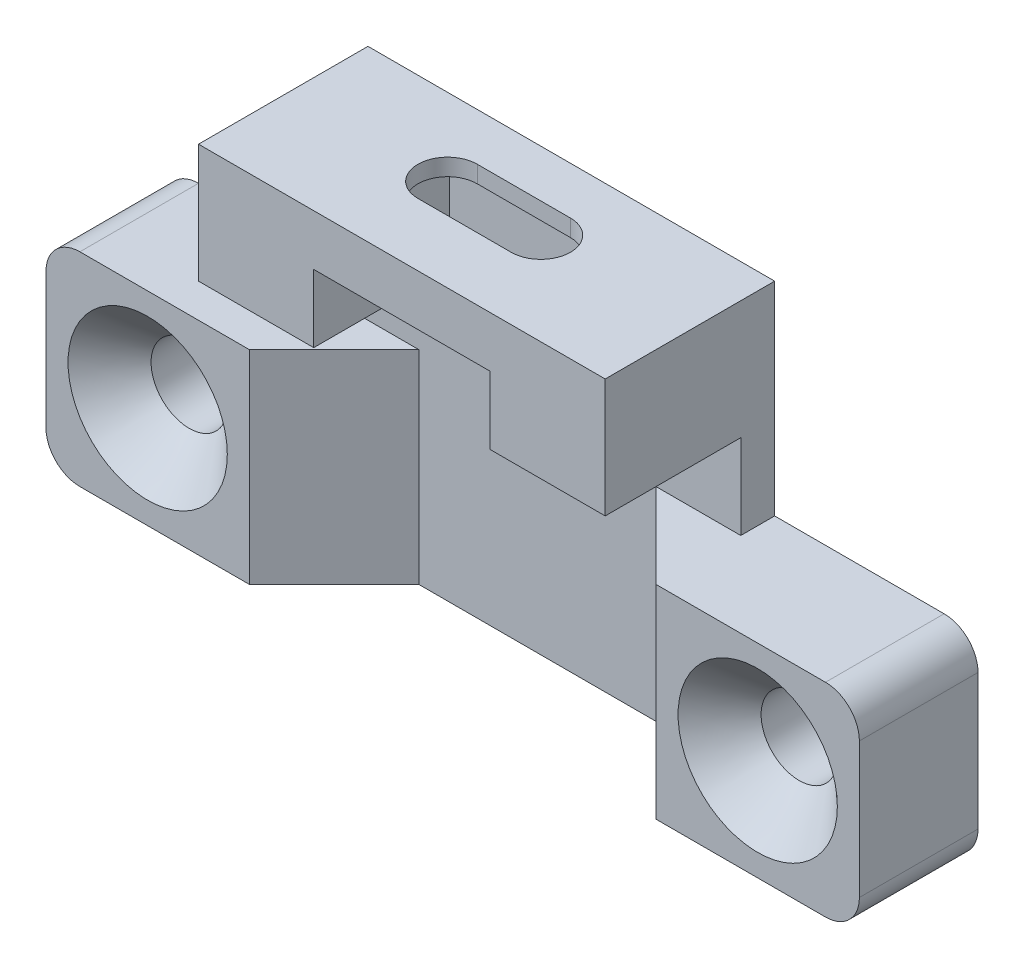
ISO-10303-21;
HEADER;
FILE_DESCRIPTION(('STEP AP214'),'2;1');
FILE_NAME('part.step','',(''),(''),'','','');
FILE_SCHEMA(('AUTOMOTIVE_DESIGN { 1 0 10303 214 1 1 1 1 }'));
ENDSEC;
DATA;
#1=APPLICATION_CONTEXT('core data for automotive mechanical design processes');
#2=APPLICATION_PROTOCOL_DEFINITION('international standard','automotive_design',2000,#1);
#3=PRODUCT_CONTEXT('',#1,'mechanical');
#4=PRODUCT('Part','Part','',(#3));
#5=PRODUCT_RELATED_PRODUCT_CATEGORY('part','',(#4));
#6=PRODUCT_DEFINITION_FORMATION('','',#4);
#7=PRODUCT_DEFINITION_CONTEXT('part definition',#1,'design');
#8=PRODUCT_DEFINITION('design','',#6,#7);
#9=PRODUCT_DEFINITION_SHAPE('','',#8);
#10=(LENGTH_UNIT() NAMED_UNIT(*) SI_UNIT(.MILLI.,.METRE.));
#11=(NAMED_UNIT(*) PLANE_ANGLE_UNIT() SI_UNIT($,.RADIAN.));
#12=(NAMED_UNIT(*) SI_UNIT($,.STERADIAN.) SOLID_ANGLE_UNIT());
#13=UNCERTAINTY_MEASURE_WITH_UNIT(LENGTH_MEASURE(1.E-05),#10,'distance_accuracy_value','');
#14=(GEOMETRIC_REPRESENTATION_CONTEXT(3) GLOBAL_UNCERTAINTY_ASSIGNED_CONTEXT((#13)) GLOBAL_UNIT_ASSIGNED_CONTEXT((#10,
#11,#12)) REPRESENTATION_CONTEXT('',''));
#15=CARTESIAN_POINT('',(0.,0.,0.));
#16=DIRECTION('',(0.,0.,1.));
#17=DIRECTION('',(1.,0.,0.));
#18=AXIS2_PLACEMENT_3D('',#15,#16,#17);
#19=CARTESIAN_POINT('',(5.2,-0.999999999999997,2.));
#20=DIRECTION('',(0.,1.,0.));
#21=DIRECTION('',(0.,0.,1.));
#22=AXIS2_PLACEMENT_3D('',#19,#20,#21);
#23=PLANE('',#22);
#24=DIRECTION('',(1.,0.,0.));
#25=VECTOR('',#24,1.);
#26=CARTESIAN_POINT('',(5.2,-0.999999999999997,2.8));
#27=LINE('',#26,#25);
#28=CARTESIAN_POINT('',(-2.75,-0.999999999999997,2.8));
#29=VERTEX_POINT('',#28);
#30=CARTESIAN_POINT('',(2.75,-0.999999999999997,2.8));
#31=VERTEX_POINT('',#30);
#32=EDGE_CURVE('E505',#29,#31,#27,.T.);
#33=ORIENTED_EDGE('',*,*,#32,.F.);
#34=CARTESIAN_POINT('',(-2.75,-0.999999999999997,4.55));
#35=DIRECTION('',(0.,1.,0.));
#36=DIRECTION('',(0.,0.,1.));
#37=AXIS2_PLACEMENT_3D('',#34,#35,#36);
#38=CIRCLE('',#37,1.75);
#39=CARTESIAN_POINT('',(-2.75,-0.999999999999997,6.3));
#40=VERTEX_POINT('',#39);
#41=EDGE_CURVE('E508',#29,#40,#38,.T.);
#42=ORIENTED_EDGE('',*,*,#41,.T.);
#43=DIRECTION('',(1.,0.,0.));
#44=VECTOR('',#43,1.);
#45=CARTESIAN_POINT('',(5.2,-0.999999999999997,6.3));
#46=LINE('',#45,#44);
#47=CARTESIAN_POINT('',(2.75,-0.999999999999997,6.3));
#48=VERTEX_POINT('',#47);
#49=EDGE_CURVE('E497',#40,#48,#46,.T.);
#50=ORIENTED_EDGE('',*,*,#49,.T.);
#51=CARTESIAN_POINT('',(2.75,-0.999999999999997,4.55));
#52=DIRECTION('',(0.,1.,0.));
#53=DIRECTION('',(0.,0.,1.));
#54=AXIS2_PLACEMENT_3D('',#51,#52,#53);
#55=CIRCLE('',#54,1.75);
#56=EDGE_CURVE('E501',#48,#31,#55,.T.);
#57=ORIENTED_EDGE('',*,*,#56,.T.);
#58=EDGE_LOOP('',(#33,#42,#50,#57));
#59=FACE_BOUND('',#58,.T.);
#60=DIRECTION('',(0.,0.,1.));
#61=VECTOR('',#60,1.);
#62=CARTESIAN_POINT('',(5.2,-0.999999999999997,2.));
#63=LINE('',#62,#61);
#64=CARTESIAN_POINT('',(5.2,-0.999999999999997,2.));
#65=VERTEX_POINT('',#64);
#66=CARTESIAN_POINT('',(5.2,-0.999999999999997,6.99999999999999));
#67=VERTEX_POINT('',#66);
#68=EDGE_CURVE('E416',#65,#67,#63,.T.);
#69=ORIENTED_EDGE('',*,*,#68,.T.);
#70=DIRECTION('',(-1.,0.,0.));
#71=VECTOR('',#70,1.);
#72=CARTESIAN_POINT('',(-5.2,-0.999999999999997,6.99999999999999));
#73=LINE('',#72,#71);
#74=CARTESIAN_POINT('',(-5.2,-0.999999999999997,6.99999999999999));
#75=VERTEX_POINT('',#74);
#76=EDGE_CURVE('E583',#67,#75,#73,.T.);
#77=ORIENTED_EDGE('',*,*,#76,.T.);
#78=DIRECTION('',(0.,0.,1.));
#79=VECTOR('',#78,1.);
#80=CARTESIAN_POINT('',(-5.2,-0.999999999999997,2.));
#81=LINE('',#80,#79);
#82=CARTESIAN_POINT('',(-5.2,-0.999999999999997,2.));
#83=VERTEX_POINT('',#82);
#84=EDGE_CURVE('E410',#83,#75,#81,.T.);
#85=ORIENTED_EDGE('',*,*,#84,.F.);
#86=DIRECTION('',(-1.,0.,0.));
#87=VECTOR('',#86,1.);
#88=CARTESIAN_POINT('',(5.2,-0.999999999999997,2.));
#89=LINE('',#88,#87);
#90=EDGE_CURVE('E387',#65,#83,#89,.T.);
#91=ORIENTED_EDGE('',*,*,#90,.F.);
#92=EDGE_LOOP('',(#69,#77,#85,#91));
#93=FACE_BOUND('',#92,.T.);
#94=ADVANCED_FACE('F47',(#59,#93),#23,.F.);
#95=CARTESIAN_POINT('',(0.,0.,2.));
#96=DIRECTION('',(0.,0.,1.));
#97=DIRECTION('',(1.,0.,0.));
#98=AXIS2_PLACEMENT_3D('',#95,#96,#97);
#99=PLANE('',#98);
#100=DIRECTION('',(1.,0.,0.));
#101=VECTOR('',#100,1.);
#102=CARTESIAN_POINT('',(-24.,-24.,2.));
#103=LINE('',#102,#101);
#104=CARTESIAN_POINT('',(-7.00000000000002,-24.,2.));
#105=VERTEX_POINT('',#104);
#106=CARTESIAN_POINT('',(7.00000000000003,-24.,2.));
#107=VERTEX_POINT('',#106);
#108=EDGE_CURVE('E400',#105,#107,#103,.T.);
#109=ORIENTED_EDGE('',*,*,#108,.T.);
#110=DIRECTION('',(0.,1.,0.));
#111=VECTOR('',#110,1.);
#112=CARTESIAN_POINT('',(7.00000000000003,0.,2.));
#113=LINE('',#112,#111);
#114=CARTESIAN_POINT('',(7.00000000000003,-12.,2.));
#115=VERTEX_POINT('',#114);
#116=EDGE_CURVE('E521',#107,#115,#113,.T.);
#117=ORIENTED_EDGE('',*,*,#116,.T.);
#118=DIRECTION('',(1.,0.,0.));
#119=VECTOR('',#118,1.);
#120=CARTESIAN_POINT('',(0.,-12.,2.));
#121=LINE('',#120,#119);
#122=CARTESIAN_POINT('',(12.,-12.,2.));
#123=VERTEX_POINT('',#122);
#124=EDGE_CURVE('E518',#115,#123,#121,.T.);
#125=ORIENTED_EDGE('',*,*,#124,.T.);
#126=DIRECTION('',(0.,1.,0.));
#127=VECTOR('',#126,1.);
#128=CARTESIAN_POINT('',(12.,0.,2.));
#129=LINE('',#128,#127);
#130=CARTESIAN_POINT('',(12.,-7.,2.));
#131=VERTEX_POINT('',#130);
#132=EDGE_CURVE('E494',#123,#131,#129,.T.);
#133=ORIENTED_EDGE('',*,*,#132,.T.);
#134=DIRECTION('',(-1.,0.,0.));
#135=VECTOR('',#134,1.);
#136=CARTESIAN_POINT('',(24.,-7.,2.));
#137=LINE('',#136,#135);
#138=CARTESIAN_POINT('',(5.2,-7.,2.));
#139=VERTEX_POINT('',#138);
#140=EDGE_CURVE('E404',#131,#139,#137,.T.);
#141=ORIENTED_EDGE('',*,*,#140,.T.);
#142=DIRECTION('',(0.,1.,0.));
#143=VECTOR('',#142,1.);
#144=CARTESIAN_POINT('',(5.2,-7.,2.));
#145=LINE('',#144,#143);
#146=EDGE_CURVE('E407',#139,#65,#145,.T.);
#147=ORIENTED_EDGE('',*,*,#146,.T.);
#148=ORIENTED_EDGE('',*,*,#90,.T.);
#149=DIRECTION('',(0.,-1.,0.));
#150=VECTOR('',#149,1.);
#151=CARTESIAN_POINT('',(-5.2,-0.999999999999997,2.));
#152=LINE('',#151,#150);
#153=CARTESIAN_POINT('',(-5.2,-7.,2.));
#154=VERTEX_POINT('',#153);
#155=EDGE_CURVE('E391',#83,#154,#152,.T.);
#156=ORIENTED_EDGE('',*,*,#155,.T.);
#157=DIRECTION('',(-1.,0.,0.));
#158=VECTOR('',#157,1.);
#159=CARTESIAN_POINT('',(-5.2,-7.,2.));
#160=LINE('',#159,#158);
#161=CARTESIAN_POINT('',(-12.,-7.,2.));
#162=VERTEX_POINT('',#161);
#163=EDGE_CURVE('E396',#154,#162,#160,.T.);
#164=ORIENTED_EDGE('',*,*,#163,.T.);
#165=DIRECTION('',(0.,-1.,0.));
#166=VECTOR('',#165,1.);
#167=CARTESIAN_POINT('',(-12.,-12.,2.));
#168=LINE('',#167,#166);
#169=CARTESIAN_POINT('',(-12.,-12.,2.));
#170=VERTEX_POINT('',#169);
#171=EDGE_CURVE('E436',#162,#170,#168,.T.);
#172=ORIENTED_EDGE('',*,*,#171,.T.);
#173=DIRECTION('',(1.,0.,0.));
#174=VECTOR('',#173,1.);
#175=CARTESIAN_POINT('',(0.,-12.,2.));
#176=LINE('',#175,#174);
#177=CARTESIAN_POINT('',(-7.00000000000002,-12.,2.));
#178=VERTEX_POINT('',#177);
#179=EDGE_CURVE('E515',#170,#178,#176,.T.);
#180=ORIENTED_EDGE('',*,*,#179,.T.);
#181=DIRECTION('',(0.,-1.,0.));
#182=VECTOR('',#181,1.);
#183=CARTESIAN_POINT('',(-7.00000000000002,0.,2.));
#184=LINE('',#183,#182);
#185=EDGE_CURVE('E512',#178,#105,#184,.T.);
#186=ORIENTED_EDGE('',*,*,#185,.T.);
#187=EDGE_LOOP('',(#109,#117,#125,#133,#141,#147,#148,#156,#164,#172,#180,#186));
#188=FACE_BOUND('',#187,.T.);
#189=ADVANCED_FACE('F591',(#188),#99,.T.);
#190=CARTESIAN_POINT('',(-24.,-12.,10.));
#191=DIRECTION('',(0.,-1.,0.));
#192=DIRECTION('',(0.,0.,-1.));
#193=AXIS2_PLACEMENT_3D('',#190,#191,#192);
#194=PLANE('',#193);
#195=DIRECTION('',(-1.,0.,0.));
#196=VECTOR('',#195,1.);
#197=CARTESIAN_POINT('',(-24.,-12.,0.));
#198=LINE('',#197,#196);
#199=CARTESIAN_POINT('',(-12.,-12.,0.));
#200=VERTEX_POINT('',#199);
#201=CARTESIAN_POINT('',(-22.,-12.,0.));
#202=VERTEX_POINT('',#201);
#203=EDGE_CURVE('E455',#200,#202,#198,.T.);
#204=ORIENTED_EDGE('',*,*,#203,.T.);
#205=DIRECTION('',(0.,0.,-1.));
#206=VECTOR('',#205,1.);
#207=CARTESIAN_POINT('',(-22.,-12.,10.));
#208=LINE('',#207,#206);
#209=CARTESIAN_POINT('',(-22.,-12.,7.));
#210=VERTEX_POINT('',#209);
#211=EDGE_CURVE('E568',#202,#210,#208,.F.);
#212=ORIENTED_EDGE('',*,*,#211,.T.);
#213=DIRECTION('',(-1.,0.,0.));
#214=VECTOR('',#213,1.);
#215=CARTESIAN_POINT('',(-24.,-12.,7.));
#216=LINE('',#215,#214);
#217=CARTESIAN_POINT('',(-12.,-12.,7.));
#218=VERTEX_POINT('',#217);
#219=EDGE_CURVE('E345',#218,#210,#216,.T.);
#220=ORIENTED_EDGE('',*,*,#219,.F.);
#221=DIRECTION('',(0.707106781186544,0.,-0.707106781186551));
#222=VECTOR('',#221,1.);
#223=CARTESIAN_POINT('',(-19.4999999999999,-12.,14.5));
#224=LINE('',#223,#222);
#225=EDGE_CURVE('E532',#218,#178,#224,.T.);
#226=ORIENTED_EDGE('',*,*,#225,.T.);
#227=ORIENTED_EDGE('',*,*,#179,.F.);
#228=DIRECTION('',(0.,0.,-1.));
#229=VECTOR('',#228,1.);
#230=CARTESIAN_POINT('',(-12.,-12.,10.));
#231=LINE('',#230,#229);
#232=EDGE_CURVE('E487',#170,#200,#231,.T.);
#233=ORIENTED_EDGE('',*,*,#232,.T.);
#234=EDGE_LOOP('',(#204,#212,#220,#226,#227,#233));
#235=FACE_BOUND('',#234,.T.);
#236=ADVANCED_FACE('F619',(#235),#194,.F.);
#237=CARTESIAN_POINT('',(-24.,-24.,10.));
#238=DIRECTION('',(1.,0.,0.));
#239=DIRECTION('',(0.,1.,0.));
#240=AXIS2_PLACEMENT_3D('',#237,#238,#239);
#241=PLANE('',#240);
#242=DIRECTION('',(0.,-1.,0.));
#243=VECTOR('',#242,1.);
#244=CARTESIAN_POINT('',(-24.,-24.,0.));
#245=LINE('',#244,#243);
#246=CARTESIAN_POINT('',(-24.,-14.,0.));
#247=VERTEX_POINT('',#246);
#248=CARTESIAN_POINT('',(-24.,-22.,0.));
#249=VERTEX_POINT('',#248);
#250=EDGE_CURVE('E459',#247,#249,#245,.T.);
#251=ORIENTED_EDGE('',*,*,#250,.T.);
#252=DIRECTION('',(0.,0.,-1.));
#253=VECTOR('',#252,1.);
#254=CARTESIAN_POINT('',(-24.,-22.,10.));
#255=LINE('',#254,#253);
#256=CARTESIAN_POINT('',(-24.,-22.,7.));
#257=VERTEX_POINT('',#256);
#258=EDGE_CURVE('E559',#249,#257,#255,.F.);
#259=ORIENTED_EDGE('',*,*,#258,.T.);
#260=DIRECTION('',(0.,-1.,0.));
#261=VECTOR('',#260,1.);
#262=CARTESIAN_POINT('',(-24.,-12.,7.));
#263=LINE('',#262,#261);
#264=CARTESIAN_POINT('',(-24.,-14.,7.));
#265=VERTEX_POINT('',#264);
#266=EDGE_CURVE('E333',#265,#257,#263,.T.);
#267=ORIENTED_EDGE('',*,*,#266,.F.);
#268=DIRECTION('',(0.,0.,-1.));
#269=VECTOR('',#268,1.);
#270=CARTESIAN_POINT('',(-24.,-14.,10.));
#271=LINE('',#270,#269);
#272=EDGE_CURVE('E555',#265,#247,#271,.T.);
#273=ORIENTED_EDGE('',*,*,#272,.T.);
#274=EDGE_LOOP('',(#251,#259,#267,#273));
#275=FACE_BOUND('',#274,.T.);
#276=ADVANCED_FACE('F631',(#275),#241,.F.);
#277=CARTESIAN_POINT('',(24.,-24.,10.));
#278=DIRECTION('',(0.,1.,0.));
#279=DIRECTION('',(-1.,0.,0.));
#280=AXIS2_PLACEMENT_3D('',#277,#278,#279);
#281=PLANE('',#280);
#282=DIRECTION('',(1.,0.,0.));
#283=VECTOR('',#282,1.);
#284=CARTESIAN_POINT('',(-24.,-24.,7.));
#285=LINE('',#284,#283);
#286=CARTESIAN_POINT('',(-22.,-24.,7.));
#287=VERTEX_POINT('',#286);
#288=CARTESIAN_POINT('',(-12.,-24.,7.));
#289=VERTEX_POINT('',#288);
#290=EDGE_CURVE('E337',#287,#289,#285,.T.);
#291=ORIENTED_EDGE('',*,*,#290,.F.);
#292=DIRECTION('',(0.,0.,-1.));
#293=VECTOR('',#292,1.);
#294=CARTESIAN_POINT('',(-22.,-24.,10.));
#295=LINE('',#294,#293);
#296=CARTESIAN_POINT('',(-22.,-24.,0.));
#297=VERTEX_POINT('',#296);
#298=EDGE_CURVE('E541',#287,#297,#295,.T.);
#299=ORIENTED_EDGE('',*,*,#298,.T.);
#300=DIRECTION('',(1.,0.,0.));
#301=VECTOR('',#300,1.);
#302=CARTESIAN_POINT('',(24.,-24.,0.));
#303=LINE('',#302,#301);
#304=CARTESIAN_POINT('',(22.,-24.,0.));
#305=VERTEX_POINT('',#304);
#306=EDGE_CURVE('E463',#297,#305,#303,.T.);
#307=ORIENTED_EDGE('',*,*,#306,.T.);
#308=DIRECTION('',(0.,0.,-1.));
#309=VECTOR('',#308,1.);
#310=CARTESIAN_POINT('',(22.,-24.,10.));
#311=LINE('',#310,#309);
#312=CARTESIAN_POINT('',(22.,-24.,7.));
#313=VERTEX_POINT('',#312);
#314=EDGE_CURVE('E539',#305,#313,#311,.F.);
#315=ORIENTED_EDGE('',*,*,#314,.T.);
#316=DIRECTION('',(1.,0.,0.));
#317=VECTOR('',#316,1.);
#318=CARTESIAN_POINT('',(24.,-24.,7.));
#319=LINE('',#318,#317);
#320=CARTESIAN_POINT('',(12.,-24.,7.));
#321=VERTEX_POINT('',#320);
#322=EDGE_CURVE('E332',#321,#313,#319,.T.);
#323=ORIENTED_EDGE('',*,*,#322,.F.);
#324=DIRECTION('',(-0.707106781186544,0.,-0.707106781186551));
#325=VECTOR('',#324,1.);
#326=CARTESIAN_POINT('',(19.4999999999999,-24.,14.5));
#327=LINE('',#326,#325);
#328=EDGE_CURVE('E525',#321,#107,#327,.T.);
#329=ORIENTED_EDGE('',*,*,#328,.T.);
#330=ORIENTED_EDGE('',*,*,#108,.F.);
#331=DIRECTION('',(-0.707106781186544,0.,0.707106781186551));
#332=VECTOR('',#331,1.);
#333=CARTESIAN_POINT('',(4.49999999999982,-24.,-9.49999999999997));
#334=LINE('',#333,#332);
#335=EDGE_CURVE('E535',#105,#289,#334,.T.);
#336=ORIENTED_EDGE('',*,*,#335,.T.);
#337=EDGE_LOOP('',(#291,#299,#307,#315,#323,#329,#330,#336));
#338=FACE_BOUND('',#337,.T.);
#339=ADVANCED_FACE('F641',(#338),#281,.F.);
#340=CARTESIAN_POINT('',(24.,-12.,10.));
#341=DIRECTION('',(-1.,0.,0.));
#342=DIRECTION('',(0.,-1.,0.));
#343=AXIS2_PLACEMENT_3D('',#340,#341,#342);
#344=PLANE('',#343);
#345=DIRECTION('',(0.,1.,0.));
#346=VECTOR('',#345,1.);
#347=CARTESIAN_POINT('',(24.,-12.,0.));
#348=LINE('',#347,#346);
#349=CARTESIAN_POINT('',(24.,-22.,0.));
#350=VERTEX_POINT('',#349);
#351=CARTESIAN_POINT('',(24.,-14.,0.));
#352=VERTEX_POINT('',#351);
#353=EDGE_CURVE('E467',#350,#352,#348,.T.);
#354=ORIENTED_EDGE('',*,*,#353,.T.);
#355=DIRECTION('',(0.,0.,-1.));
#356=VECTOR('',#355,1.);
#357=CARTESIAN_POINT('',(24.,-14.,10.));
#358=LINE('',#357,#356);
#359=CARTESIAN_POINT('',(24.,-14.,7.));
#360=VERTEX_POINT('',#359);
#361=EDGE_CURVE('E577',#352,#360,#358,.F.);
#362=ORIENTED_EDGE('',*,*,#361,.T.);
#363=DIRECTION('',(0.,1.,0.));
#364=VECTOR('',#363,1.);
#365=CARTESIAN_POINT('',(24.,-12.,7.));
#366=LINE('',#365,#364);
#367=CARTESIAN_POINT('',(24.,-22.,7.));
#368=VERTEX_POINT('',#367);
#369=EDGE_CURVE('E338',#368,#360,#366,.T.);
#370=ORIENTED_EDGE('',*,*,#369,.F.);
#371=DIRECTION('',(0.,0.,-1.));
#372=VECTOR('',#371,1.);
#373=CARTESIAN_POINT('',(24.,-22.,10.));
#374=LINE('',#373,#372);
#375=EDGE_CURVE('E574',#368,#350,#374,.T.);
#376=ORIENTED_EDGE('',*,*,#375,.T.);
#377=EDGE_LOOP('',(#354,#362,#370,#376));
#378=FACE_BOUND('',#377,.T.);
#379=ADVANCED_FACE('F650',(#378),#344,.F.);
#380=CARTESIAN_POINT('',(12.,-12.,10.));
#381=DIRECTION('',(0.,-1.,0.));
#382=DIRECTION('',(1.,0.,0.));
#383=AXIS2_PLACEMENT_3D('',#380,#381,#382);
#384=PLANE('',#383);
#385=DIRECTION('',(-1.,0.,0.));
#386=VECTOR('',#385,1.);
#387=CARTESIAN_POINT('',(24.,-12.,7.));
#388=LINE('',#387,#386);
#389=CARTESIAN_POINT('',(22.,-12.,7.));
#390=VERTEX_POINT('',#389);
#391=CARTESIAN_POINT('',(12.,-12.,7.));
#392=VERTEX_POINT('',#391);
#393=EDGE_CURVE('E356',#390,#392,#388,.T.);
#394=ORIENTED_EDGE('',*,*,#393,.F.);
#395=DIRECTION('',(0.,0.,-1.));
#396=VECTOR('',#395,1.);
#397=CARTESIAN_POINT('',(22.,-12.,10.));
#398=LINE('',#397,#396);
#399=CARTESIAN_POINT('',(22.,-12.,0.));
#400=VERTEX_POINT('',#399);
#401=EDGE_CURVE('E571',#390,#400,#398,.T.);
#402=ORIENTED_EDGE('',*,*,#401,.T.);
#403=DIRECTION('',(-1.,0.,0.));
#404=VECTOR('',#403,1.);
#405=CARTESIAN_POINT('',(12.,-12.,0.));
#406=LINE('',#405,#404);
#407=CARTESIAN_POINT('',(12.,-12.,0.));
#408=VERTEX_POINT('',#407);
#409=EDGE_CURVE('E470',#400,#408,#406,.T.);
#410=ORIENTED_EDGE('',*,*,#409,.T.);
#411=DIRECTION('',(0.,0.,-1.));
#412=VECTOR('',#411,1.);
#413=CARTESIAN_POINT('',(12.,-12.,10.));
#414=LINE('',#413,#412);
#415=EDGE_CURVE('E484',#123,#408,#414,.T.);
#416=ORIENTED_EDGE('',*,*,#415,.F.);
#417=ORIENTED_EDGE('',*,*,#124,.F.);
#418=DIRECTION('',(0.707106781186544,0.,0.707106781186551));
#419=VECTOR('',#418,1.);
#420=CARTESIAN_POINT('',(13.5,-12.,8.50000000000003));
#421=LINE('',#420,#419);
#422=EDGE_CURVE('E528',#115,#392,#421,.T.);
#423=ORIENTED_EDGE('',*,*,#422,.T.);
#424=EDGE_LOOP('',(#394,#402,#410,#416,#417,#423));
#425=FACE_BOUND('',#424,.T.);
#426=ADVANCED_FACE('F661',(#425),#384,.F.);
#427=CARTESIAN_POINT('',(-12.,-12.,10.));
#428=DIRECTION('',(1.,0.,0.));
#429=DIRECTION('',(0.,0.,-1.));
#430=AXIS2_PLACEMENT_3D('',#427,#428,#429);
#431=PLANE('',#430);
#432=ORIENTED_EDGE('',*,*,#171,.F.);
#433=DIRECTION('',(0.,0.,1.));
#434=VECTOR('',#433,1.);
#435=CARTESIAN_POINT('',(-12.,-7.,10.));
#436=LINE('',#435,#434);
#437=CARTESIAN_POINT('',(-12.,-7.,10.));
#438=VERTEX_POINT('',#437);
#439=EDGE_CURVE('E419',#162,#438,#436,.T.);
#440=ORIENTED_EDGE('',*,*,#439,.T.);
#441=DIRECTION('',(0.,-1.,0.));
#442=VECTOR('',#441,1.);
#443=CARTESIAN_POINT('',(-12.,-12.,10.));
#444=LINE('',#443,#442);
#445=CARTESIAN_POINT('',(-12.,0.,10.));
#446=VERTEX_POINT('',#445);
#447=EDGE_CURVE('E441',#446,#438,#444,.T.);
#448=ORIENTED_EDGE('',*,*,#447,.F.);
#449=DIRECTION('',(0.,0.,-1.));
#450=VECTOR('',#449,1.);
#451=CARTESIAN_POINT('',(-12.,0.,10.));
#452=LINE('',#451,#450);
#453=CARTESIAN_POINT('',(-12.,0.,0.));
#454=VERTEX_POINT('',#453);
#455=EDGE_CURVE('E451',#446,#454,#452,.T.);
#456=ORIENTED_EDGE('',*,*,#455,.T.);
#457=DIRECTION('',(0.,-1.,0.));
#458=VECTOR('',#457,1.);
#459=CARTESIAN_POINT('',(-12.,-12.,0.));
#460=LINE('',#459,#458);
#461=EDGE_CURVE('E440',#454,#200,#460,.T.);
#462=ORIENTED_EDGE('',*,*,#461,.T.);
#463=ORIENTED_EDGE('',*,*,#232,.F.);
#464=EDGE_LOOP('',(#432,#440,#448,#456,#462,#463));
#465=FACE_BOUND('',#464,.T.);
#466=ADVANCED_FACE('F611',(#465),#431,.F.);
#467=CARTESIAN_POINT('',(12.,0.,10.));
#468=DIRECTION('',(-1.,0.,0.));
#469=DIRECTION('',(0.,-1.,0.));
#470=AXIS2_PLACEMENT_3D('',#467,#468,#469);
#471=PLANE('',#470);
#472=DIRECTION('',(0.,1.,0.));
#473=VECTOR('',#472,1.);
#474=CARTESIAN_POINT('',(12.,0.,10.));
#475=LINE('',#474,#473);
#476=CARTESIAN_POINT('',(12.,-7.,10.));
#477=VERTEX_POINT('',#476);
#478=CARTESIAN_POINT('',(12.,0.,10.));
#479=VERTEX_POINT('',#478);
#480=EDGE_CURVE('E444',#477,#479,#475,.T.);
#481=ORIENTED_EDGE('',*,*,#480,.F.);
#482=DIRECTION('',(0.,0.,-1.));
#483=VECTOR('',#482,1.);
#484=CARTESIAN_POINT('',(12.,-7.,10.));
#485=LINE('',#484,#483);
#486=EDGE_CURVE('E432',#477,#131,#485,.T.);
#487=ORIENTED_EDGE('',*,*,#486,.T.);
#488=ORIENTED_EDGE('',*,*,#132,.F.);
#489=ORIENTED_EDGE('',*,*,#415,.T.);
#490=DIRECTION('',(0.,1.,0.));
#491=VECTOR('',#490,1.);
#492=CARTESIAN_POINT('',(12.,0.,0.));
#493=LINE('',#492,#491);
#494=CARTESIAN_POINT('',(12.,0.,0.));
#495=VERTEX_POINT('',#494);
#496=EDGE_CURVE('E472',#408,#495,#493,.T.);
#497=ORIENTED_EDGE('',*,*,#496,.T.);
#498=DIRECTION('',(0.,0.,-1.));
#499=VECTOR('',#498,1.);
#500=CARTESIAN_POINT('',(12.,0.,10.));
#501=LINE('',#500,#499);
#502=EDGE_CURVE('E480',#479,#495,#501,.T.);
#503=ORIENTED_EDGE('',*,*,#502,.F.);
#504=EDGE_LOOP('',(#481,#487,#488,#489,#497,#503));
#505=FACE_BOUND('',#504,.T.);
#506=ADVANCED_FACE('F600',(#505),#471,.F.);
#507=CARTESIAN_POINT('',(-12.,0.,10.));
#508=DIRECTION('',(0.,-1.,0.));
#509=DIRECTION('',(1.,0.,0.));
#510=AXIS2_PLACEMENT_3D('',#507,#508,#509);
#511=PLANE('',#510);
#512=DIRECTION('',(1.,0.,0.));
#513=VECTOR('',#512,1.);
#514=CARTESIAN_POINT('',(-2.75,0.,6.3));
#515=LINE('',#514,#513);
#516=CARTESIAN_POINT('',(-2.75,0.,6.3));
#517=VERTEX_POINT('',#516);
#518=CARTESIAN_POINT('',(2.75,0.,6.3));
#519=VERTEX_POINT('',#518);
#520=EDGE_CURVE('E363',#517,#519,#515,.T.);
#521=ORIENTED_EDGE('',*,*,#520,.F.);
#522=CARTESIAN_POINT('',(-2.75,0.,4.55));
#523=DIRECTION('',(0.,1.,0.));
#524=DIRECTION('',(-1.,0.,0.));
#525=AXIS2_PLACEMENT_3D('',#522,#523,#524);
#526=CIRCLE('',#525,1.75);
#527=CARTESIAN_POINT('',(-2.75,0.,2.8));
#528=VERTEX_POINT('',#527);
#529=EDGE_CURVE('E349',#528,#517,#526,.T.);
#530=ORIENTED_EDGE('',*,*,#529,.F.);
#531=DIRECTION('',(1.,0.,0.));
#532=VECTOR('',#531,1.);
#533=CARTESIAN_POINT('',(-2.75,0.,2.8));
#534=LINE('',#533,#532);
#535=CARTESIAN_POINT('',(2.75,0.,2.8));
#536=VERTEX_POINT('',#535);
#537=EDGE_CURVE('E371',#528,#536,#534,.T.);
#538=ORIENTED_EDGE('',*,*,#537,.T.);
#539=CARTESIAN_POINT('',(2.75,0.,4.55));
#540=DIRECTION('',(0.,1.,0.));
#541=DIRECTION('',(-1.,0.,0.));
#542=AXIS2_PLACEMENT_3D('',#539,#540,#541);
#543=CIRCLE('',#542,1.75);
#544=EDGE_CURVE('E367',#519,#536,#543,.T.);
#545=ORIENTED_EDGE('',*,*,#544,.F.);
#546=EDGE_LOOP('',(#521,#530,#538,#545));
#547=FACE_BOUND('',#546,.T.);
#548=DIRECTION('',(-1.,0.,0.));
#549=VECTOR('',#548,1.);
#550=CARTESIAN_POINT('',(-12.,0.,0.));
#551=LINE('',#550,#549);
#552=EDGE_CURVE('E445',#495,#454,#551,.T.);
#553=ORIENTED_EDGE('',*,*,#552,.T.);
#554=ORIENTED_EDGE('',*,*,#455,.F.);
#555=DIRECTION('',(-1.,0.,0.));
#556=VECTOR('',#555,1.);
#557=CARTESIAN_POINT('',(-12.,0.,10.));
#558=LINE('',#557,#556);
#559=EDGE_CURVE('E448',#479,#446,#558,.T.);
#560=ORIENTED_EDGE('',*,*,#559,.F.);
#561=ORIENTED_EDGE('',*,*,#502,.T.);
#562=EDGE_LOOP('',(#553,#554,#560,#561));
#563=FACE_BOUND('',#562,.T.);
#564=ADVANCED_FACE('F607',(#547,#563),#511,.F.);
#565=CARTESIAN_POINT('',(0.,0.,10.));
#566=DIRECTION('',(0.,0.,-1.));
#567=DIRECTION('',(-1.,0.,0.));
#568=AXIS2_PLACEMENT_3D('',#565,#566,#567);
#569=PLANE('',#568);
#570=DIRECTION('',(0.,1.,0.));
#571=VECTOR('',#570,1.);
#572=CARTESIAN_POINT('',(5.2,-7.,10.));
#573=LINE('',#572,#571);
#574=CARTESIAN_POINT('',(5.2,-7.,10.));
#575=VERTEX_POINT('',#574);
#576=CARTESIAN_POINT('',(5.2,-3.,10.));
#577=VERTEX_POINT('',#576);
#578=EDGE_CURVE('E392',#575,#577,#573,.T.);
#579=ORIENTED_EDGE('',*,*,#578,.F.);
#580=DIRECTION('',(1.,0.,0.));
#581=VECTOR('',#580,1.);
#582=CARTESIAN_POINT('',(0.,-7.,10.));
#583=LINE('',#582,#581);
#584=EDGE_CURVE('E490',#575,#477,#583,.T.);
#585=ORIENTED_EDGE('',*,*,#584,.T.);
#586=ORIENTED_EDGE('',*,*,#480,.T.);
#587=ORIENTED_EDGE('',*,*,#559,.T.);
#588=ORIENTED_EDGE('',*,*,#447,.T.);
#589=DIRECTION('',(-1.,0.,0.));
#590=VECTOR('',#589,1.);
#591=CARTESIAN_POINT('',(-5.2,-7.,10.));
#592=LINE('',#591,#590);
#593=CARTESIAN_POINT('',(-5.2,-7.,10.));
#594=VERTEX_POINT('',#593);
#595=EDGE_CURVE('E284',#594,#438,#592,.T.);
#596=ORIENTED_EDGE('',*,*,#595,.F.);
#597=DIRECTION('',(0.,-1.,0.));
#598=VECTOR('',#597,1.);
#599=CARTESIAN_POINT('',(-5.2,-0.999999999999997,10.));
#600=LINE('',#599,#598);
#601=CARTESIAN_POINT('',(-5.2,-3.,10.));
#602=VERTEX_POINT('',#601);
#603=EDGE_CURVE('E277',#602,#594,#600,.T.);
#604=ORIENTED_EDGE('',*,*,#603,.F.);
#605=DIRECTION('',(1.,0.,0.));
#606=VECTOR('',#605,1.);
#607=CARTESIAN_POINT('',(-5.2,-3.,10.));
#608=LINE('',#607,#606);
#609=EDGE_CURVE('E282',#602,#577,#608,.T.);
#610=ORIENTED_EDGE('',*,*,#609,.T.);
#611=EDGE_LOOP('',(#579,#585,#586,#587,#588,#596,#604,#610));
#612=FACE_BOUND('',#611,.T.);
#613=ADVANCED_FACE('F280',(#612),#569,.F.);
#614=CARTESIAN_POINT('',(0.,0.,0.));
#615=DIRECTION('',(0.,0.,-1.));
#616=DIRECTION('',(-1.,0.,0.));
#617=AXIS2_PLACEMENT_3D('',#614,#615,#616);
#618=PLANE('',#617);
#619=CARTESIAN_POINT('',(-18.,-18.,0.));
#620=DIRECTION('',(0.,0.,1.));
#621=DIRECTION('',(1.,0.,0.));
#622=AXIS2_PLACEMENT_3D('',#619,#620,#621);
#623=CIRCLE('',#622,2.25);
#624=CARTESIAN_POINT('',(-15.75,-18.,0.));
#625=VERTEX_POINT('',#624);
#626=EDGE_CURVE('E318',#625,#625,#623,.T.);
#627=ORIENTED_EDGE('',*,*,#626,.T.);
#628=EDGE_LOOP('',(#627));
#629=FACE_BOUND('',#628,.T.);
#630=CARTESIAN_POINT('',(18.,-18.,0.));
#631=DIRECTION('',(0.,0.,1.));
#632=DIRECTION('',(1.,0.,0.));
#633=AXIS2_PLACEMENT_3D('',#630,#631,#632);
#634=CIRCLE('',#633,2.25);
#635=CARTESIAN_POINT('',(20.25,-18.,0.));
#636=VERTEX_POINT('',#635);
#637=EDGE_CURVE('E329',#636,#636,#634,.T.);
#638=ORIENTED_EDGE('',*,*,#637,.T.);
#639=EDGE_LOOP('',(#638));
#640=FACE_BOUND('',#639,.T.);
#641=ORIENTED_EDGE('',*,*,#306,.F.);
#642=CARTESIAN_POINT('',(-22.,-22.,0.));
#643=DIRECTION('',(0.,0.,-1.));
#644=DIRECTION('',(-1.,0.,0.));
#645=AXIS2_PLACEMENT_3D('',#642,#643,#644);
#646=CIRCLE('',#645,2.);
#647=EDGE_CURVE('E552',#297,#249,#646,.T.);
#648=ORIENTED_EDGE('',*,*,#647,.T.);
#649=ORIENTED_EDGE('',*,*,#250,.F.);
#650=CARTESIAN_POINT('',(-22.,-14.,0.));
#651=DIRECTION('',(0.,0.,-1.));
#652=DIRECTION('',(-1.,0.,0.));
#653=AXIS2_PLACEMENT_3D('',#650,#651,#652);
#654=CIRCLE('',#653,2.);
#655=EDGE_CURVE('E549',#247,#202,#654,.T.);
#656=ORIENTED_EDGE('',*,*,#655,.T.);
#657=ORIENTED_EDGE('',*,*,#203,.F.);
#658=ORIENTED_EDGE('',*,*,#461,.F.);
#659=ORIENTED_EDGE('',*,*,#552,.F.);
#660=ORIENTED_EDGE('',*,*,#496,.F.);
#661=ORIENTED_EDGE('',*,*,#409,.F.);
#662=CARTESIAN_POINT('',(22.,-14.,0.));
#663=DIRECTION('',(0.,0.,-1.));
#664=DIRECTION('',(-1.,0.,0.));
#665=AXIS2_PLACEMENT_3D('',#662,#663,#664);
#666=CIRCLE('',#665,2.);
#667=EDGE_CURVE('E547',#400,#352,#666,.T.);
#668=ORIENTED_EDGE('',*,*,#667,.T.);
#669=ORIENTED_EDGE('',*,*,#353,.F.);
#670=CARTESIAN_POINT('',(22.,-22.,0.));
#671=DIRECTION('',(0.,0.,-1.));
#672=DIRECTION('',(-1.,0.,0.));
#673=AXIS2_PLACEMENT_3D('',#670,#671,#672);
#674=CIRCLE('',#673,2.);
#675=EDGE_CURVE('E545',#350,#305,#674,.T.);
#676=ORIENTED_EDGE('',*,*,#675,.T.);
#677=EDGE_LOOP('',(#641,#648,#649,#656,#657,#658,#659,#660,#661,#668,#669,#676));
#678=FACE_BOUND('',#677,.T.);
#679=ADVANCED_FACE('F623',(#629,#640,#678),#618,.T.);
#680=CARTESIAN_POINT('',(24.,-7.,2.));
#681=DIRECTION('',(0.,1.,0.));
#682=DIRECTION('',(-1.,0.,0.));
#683=AXIS2_PLACEMENT_3D('',#680,#681,#682);
#684=PLANE('',#683);
#685=ORIENTED_EDGE('',*,*,#584,.F.);
#686=DIRECTION('',(0.,0.,1.));
#687=VECTOR('',#686,1.);
#688=CARTESIAN_POINT('',(5.2,-7.,2.));
#689=LINE('',#688,#687);
#690=EDGE_CURVE('E420',#139,#575,#689,.T.);
#691=ORIENTED_EDGE('',*,*,#690,.F.);
#692=ORIENTED_EDGE('',*,*,#140,.F.);
#693=ORIENTED_EDGE('',*,*,#486,.F.);
#694=EDGE_LOOP('',(#685,#691,#692,#693));
#695=FACE_BOUND('',#694,.T.);
#696=ADVANCED_FACE('F701',(#695),#684,.F.);
#697=CARTESIAN_POINT('',(-5.2,-7.,2.));
#698=DIRECTION('',(0.,1.,0.));
#699=DIRECTION('',(-1.,0.,0.));
#700=AXIS2_PLACEMENT_3D('',#697,#698,#699);
#701=PLANE('',#700);
#702=ORIENTED_EDGE('',*,*,#163,.F.);
#703=DIRECTION('',(0.,0.,1.));
#704=VECTOR('',#703,1.);
#705=CARTESIAN_POINT('',(-5.2,-7.,2.));
#706=LINE('',#705,#704);
#707=EDGE_CURVE('E424',#154,#594,#706,.T.);
#708=ORIENTED_EDGE('',*,*,#707,.T.);
#709=ORIENTED_EDGE('',*,*,#595,.T.);
#710=ORIENTED_EDGE('',*,*,#439,.F.);
#711=EDGE_LOOP('',(#702,#708,#709,#710));
#712=FACE_BOUND('',#711,.T.);
#713=ADVANCED_FACE('F615',(#712),#701,.F.);
#714=CARTESIAN_POINT('',(5.2,-7.,2.));
#715=DIRECTION('',(1.,0.,0.));
#716=DIRECTION('',(0.,0.,-1.));
#717=AXIS2_PLACEMENT_3D('',#714,#715,#716);
#718=PLANE('',#717);
#719=DIRECTION('',(0.,0.,1.));
#720=VECTOR('',#719,1.);
#721=CARTESIAN_POINT('',(5.2,-3.,9.));
#722=LINE('',#721,#720);
#723=CARTESIAN_POINT('',(5.2,-3.,9.));
#724=VERTEX_POINT('',#723);
#725=EDGE_CURVE('E297',#724,#577,#722,.T.);
#726=ORIENTED_EDGE('',*,*,#725,.F.);
#727=DIRECTION('',(0.,-0.707106781186544,0.707106781186551));
#728=VECTOR('',#727,1.);
#729=CARTESIAN_POINT('',(5.2,-0.999999999999997,6.99999999999999));
#730=LINE('',#729,#728);
#731=EDGE_CURVE('E11',#724,#67,#730,.F.);
#732=ORIENTED_EDGE('',*,*,#731,.T.);
#733=ORIENTED_EDGE('',*,*,#68,.F.);
#734=ORIENTED_EDGE('',*,*,#146,.F.);
#735=ORIENTED_EDGE('',*,*,#690,.T.);
#736=ORIENTED_EDGE('',*,*,#578,.T.);
#737=EDGE_LOOP('',(#726,#732,#733,#734,#735,#736));
#738=FACE_BOUND('',#737,.T.);
#739=ADVANCED_FACE('F595',(#738),#718,.F.);
#740=CARTESIAN_POINT('',(-5.2,-0.999999999999997,2.));
#741=DIRECTION('',(-1.,0.,0.));
#742=DIRECTION('',(0.,0.,1.));
#743=AXIS2_PLACEMENT_3D('',#740,#741,#742);
#744=PLANE('',#743);
#745=ORIENTED_EDGE('',*,*,#84,.T.);
#746=DIRECTION('',(0.,0.707106781186544,-0.707106781186551));
#747=VECTOR('',#746,1.);
#748=CARTESIAN_POINT('',(-5.2,-0.999999999999997,6.99999999999999));
#749=LINE('',#748,#747);
#750=CARTESIAN_POINT('',(-5.2,-3.,9.));
#751=VERTEX_POINT('',#750);
#752=EDGE_CURVE('E57',#75,#751,#749,.F.);
#753=ORIENTED_EDGE('',*,*,#752,.T.);
#754=DIRECTION('',(0.,0.,1.));
#755=VECTOR('',#754,1.);
#756=CARTESIAN_POINT('',(-5.2,-3.,9.));
#757=LINE('',#756,#755);
#758=EDGE_CURVE('E291',#751,#602,#757,.T.);
#759=ORIENTED_EDGE('',*,*,#758,.T.);
#760=ORIENTED_EDGE('',*,*,#603,.T.);
#761=ORIENTED_EDGE('',*,*,#707,.F.);
#762=ORIENTED_EDGE('',*,*,#155,.F.);
#763=EDGE_LOOP('',(#745,#753,#759,#760,#761,#762));
#764=FACE_BOUND('',#763,.T.);
#765=ADVANCED_FACE('F293',(#764),#744,.F.);
#766=CARTESIAN_POINT('',(-2.75,-6.,4.55));
#767=DIRECTION('',(0.,1.,0.));
#768=DIRECTION('',(-1.,0.,0.));
#769=AXIS2_PLACEMENT_3D('',#766,#767,#768);
#770=CYLINDRICAL_SURFACE('',#769,1.75);
#771=DIRECTION('',(0.,1.,0.));
#772=VECTOR('',#771,1.);
#773=CARTESIAN_POINT('',(-2.75,-6.,2.8));
#774=LINE('',#773,#772);
#775=EDGE_CURVE('E288',#29,#528,#774,.T.);
#776=ORIENTED_EDGE('',*,*,#775,.T.);
#777=ORIENTED_EDGE('',*,*,#529,.T.);
#778=DIRECTION('',(0.,1.,0.));
#779=VECTOR('',#778,1.);
#780=CARTESIAN_POINT('',(-2.75,-6.,6.3));
#781=LINE('',#780,#779);
#782=EDGE_CURVE('E375',#40,#517,#781,.T.);
#783=ORIENTED_EDGE('',*,*,#782,.F.);
#784=ORIENTED_EDGE('',*,*,#41,.F.);
#785=EDGE_LOOP('',(#776,#777,#783,#784));
#786=FACE_BOUND('',#785,.T.);
#787=ADVANCED_FACE('F839',(#786),#770,.F.);
#788=CARTESIAN_POINT('',(-2.75,-6.,2.8));
#789=DIRECTION('',(0.,0.,1.));
#790=DIRECTION('',(1.,0.,0.));
#791=AXIS2_PLACEMENT_3D('',#788,#789,#790);
#792=PLANE('',#791);
#793=ORIENTED_EDGE('',*,*,#32,.T.);
#794=DIRECTION('',(0.,1.,0.));
#795=VECTOR('',#794,1.);
#796=CARTESIAN_POINT('',(2.75,-6.,2.8));
#797=LINE('',#796,#795);
#798=EDGE_CURVE('E378',#31,#536,#797,.T.);
#799=ORIENTED_EDGE('',*,*,#798,.T.);
#800=ORIENTED_EDGE('',*,*,#537,.F.);
#801=ORIENTED_EDGE('',*,*,#775,.F.);
#802=EDGE_LOOP('',(#793,#799,#800,#801));
#803=FACE_BOUND('',#802,.T.);
#804=ADVANCED_FACE('F870',(#803),#792,.T.);
#805=CARTESIAN_POINT('',(2.75,-6.,4.55));
#806=DIRECTION('',(0.,1.,0.));
#807=DIRECTION('',(-1.,0.,0.));
#808=AXIS2_PLACEMENT_3D('',#805,#806,#807);
#809=CYLINDRICAL_SURFACE('',#808,1.75);
#810=DIRECTION('',(0.,1.,0.));
#811=VECTOR('',#810,1.);
#812=CARTESIAN_POINT('',(2.75,-6.,6.3));
#813=LINE('',#812,#811);
#814=EDGE_CURVE('E381',#48,#519,#813,.T.);
#815=ORIENTED_EDGE('',*,*,#814,.T.);
#816=ORIENTED_EDGE('',*,*,#544,.T.);
#817=ORIENTED_EDGE('',*,*,#798,.F.);
#818=ORIENTED_EDGE('',*,*,#56,.F.);
#819=EDGE_LOOP('',(#815,#816,#817,#818));
#820=FACE_BOUND('',#819,.T.);
#821=ADVANCED_FACE('F873',(#820),#809,.F.);
#822=CARTESIAN_POINT('',(-2.75,-6.,6.3));
#823=DIRECTION('',(0.,0.,1.));
#824=DIRECTION('',(1.,0.,0.));
#825=AXIS2_PLACEMENT_3D('',#822,#823,#824);
#826=PLANE('',#825);
#827=ORIENTED_EDGE('',*,*,#782,.T.);
#828=ORIENTED_EDGE('',*,*,#520,.T.);
#829=ORIENTED_EDGE('',*,*,#814,.F.);
#830=ORIENTED_EDGE('',*,*,#49,.F.);
#831=EDGE_LOOP('',(#827,#828,#829,#830));
#832=FACE_BOUND('',#831,.T.);
#833=ADVANCED_FACE('F725',(#832),#826,.F.);
#834=CARTESIAN_POINT('',(0.,0.,7.));
#835=DIRECTION('',(0.,0.,-1.));
#836=DIRECTION('',(-1.,0.,0.));
#837=AXIS2_PLACEMENT_3D('',#834,#835,#836);
#838=PLANE('',#837);
#839=CARTESIAN_POINT('',(18.,-18.,7.));
#840=DIRECTION('',(0.,0.,1.));
#841=DIRECTION('',(1.,0.,0.));
#842=AXIS2_PLACEMENT_3D('',#839,#840,#841);
#843=CIRCLE('',#842,4.7);
#844=CARTESIAN_POINT('',(22.7,-18.,7.));
#845=VERTEX_POINT('',#844);
#846=EDGE_CURVE('E322',#845,#845,#843,.T.);
#847=ORIENTED_EDGE('',*,*,#846,.F.);
#848=EDGE_LOOP('',(#847));
#849=FACE_BOUND('',#848,.T.);
#850=ORIENTED_EDGE('',*,*,#369,.T.);
#851=CARTESIAN_POINT('',(22.,-14.,7.));
#852=DIRECTION('',(0.,0.,-1.));
#853=DIRECTION('',(-1.,0.,0.));
#854=AXIS2_PLACEMENT_3D('',#851,#852,#853);
#855=CIRCLE('',#854,2.);
#856=EDGE_CURVE('E581',#360,#390,#855,.F.);
#857=ORIENTED_EDGE('',*,*,#856,.T.);
#858=ORIENTED_EDGE('',*,*,#393,.T.);
#859=DIRECTION('',(0.,-1.,0.));
#860=VECTOR('',#859,1.);
#861=CARTESIAN_POINT('',(12.,-12.,7.));
#862=LINE('',#861,#860);
#863=EDGE_CURVE('E352',#392,#321,#862,.T.);
#864=ORIENTED_EDGE('',*,*,#863,.T.);
#865=ORIENTED_EDGE('',*,*,#322,.T.);
#866=CARTESIAN_POINT('',(22.,-22.,7.));
#867=DIRECTION('',(0.,0.,-1.));
#868=DIRECTION('',(-1.,0.,0.));
#869=AXIS2_PLACEMENT_3D('',#866,#867,#868);
#870=CIRCLE('',#869,2.);
#871=EDGE_CURVE('E579',#313,#368,#870,.F.);
#872=ORIENTED_EDGE('',*,*,#871,.T.);
#873=EDGE_LOOP('',(#850,#857,#858,#864,#865,#872));
#874=FACE_BOUND('',#873,.T.);
#875=ADVANCED_FACE('F654',(#849,#874),#838,.F.);
#876=CARTESIAN_POINT('',(0.,0.,7.));
#877=DIRECTION('',(0.,0.,1.));
#878=DIRECTION('',(1.,0.,0.));
#879=AXIS2_PLACEMENT_3D('',#876,#877,#878);
#880=PLANE('',#879);
#881=CARTESIAN_POINT('',(-18.,-18.,7.));
#882=DIRECTION('',(0.,0.,1.));
#883=DIRECTION('',(1.,0.,0.));
#884=AXIS2_PLACEMENT_3D('',#881,#882,#883);
#885=CIRCLE('',#884,4.7);
#886=CARTESIAN_POINT('',(-13.3,-18.,7.));
#887=VERTEX_POINT('',#886);
#888=EDGE_CURVE('E309',#887,#887,#885,.T.);
#889=ORIENTED_EDGE('',*,*,#888,.F.);
#890=EDGE_LOOP('',(#889));
#891=FACE_BOUND('',#890,.T.);
#892=ORIENTED_EDGE('',*,*,#266,.T.);
#893=CARTESIAN_POINT('',(-22.,-22.,7.));
#894=DIRECTION('',(0.,0.,1.));
#895=DIRECTION('',(1.,0.,0.));
#896=AXIS2_PLACEMENT_3D('',#893,#894,#895);
#897=CIRCLE('',#896,2.);
#898=EDGE_CURVE('E565',#257,#287,#897,.T.);
#899=ORIENTED_EDGE('',*,*,#898,.T.);
#900=ORIENTED_EDGE('',*,*,#290,.T.);
#901=DIRECTION('',(0.,1.,0.));
#902=VECTOR('',#901,1.);
#903=CARTESIAN_POINT('',(-12.,-12.,7.));
#904=LINE('',#903,#902);
#905=EDGE_CURVE('E341',#289,#218,#904,.T.);
#906=ORIENTED_EDGE('',*,*,#905,.T.);
#907=ORIENTED_EDGE('',*,*,#219,.T.);
#908=CARTESIAN_POINT('',(-22.,-14.,7.));
#909=DIRECTION('',(0.,0.,1.));
#910=DIRECTION('',(1.,0.,0.));
#911=AXIS2_PLACEMENT_3D('',#908,#909,#910);
#912=CIRCLE('',#911,2.);
#913=EDGE_CURVE('E562',#210,#265,#912,.T.);
#914=ORIENTED_EDGE('',*,*,#913,.T.);
#915=EDGE_LOOP('',(#892,#899,#900,#906,#907,#914));
#916=FACE_BOUND('',#915,.T.);
#917=ADVANCED_FACE('F635',(#891,#916),#880,.T.);
#918=CARTESIAN_POINT('',(12.,-12.,7.00000000000003));
#919=DIRECTION('',(0.707106781186551,0.,-0.707106781186544));
#920=DIRECTION('',(0.,-1.,0.));
#921=AXIS2_PLACEMENT_3D('',#918,#919,#920);
#922=PLANE('',#921);
#923=ORIENTED_EDGE('',*,*,#422,.F.);
#924=ORIENTED_EDGE('',*,*,#116,.F.);
#925=ORIENTED_EDGE('',*,*,#328,.F.);
#926=ORIENTED_EDGE('',*,*,#863,.F.);
#927=EDGE_LOOP('',(#923,#924,#925,#926));
#928=FACE_BOUND('',#927,.T.);
#929=ADVANCED_FACE('F670',(#928),#922,.F.);
#930=CARTESIAN_POINT('',(-12.,-12.,7.00000000000003));
#931=DIRECTION('',(-0.707106781186551,0.,-0.707106781186544));
#932=DIRECTION('',(0.,1.,0.));
#933=AXIS2_PLACEMENT_3D('',#930,#931,#932);
#934=PLANE('',#933);
#935=ORIENTED_EDGE('',*,*,#335,.F.);
#936=ORIENTED_EDGE('',*,*,#185,.F.);
#937=ORIENTED_EDGE('',*,*,#225,.F.);
#938=ORIENTED_EDGE('',*,*,#905,.F.);
#939=EDGE_LOOP('',(#935,#936,#937,#938));
#940=FACE_BOUND('',#939,.T.);
#941=ADVANCED_FACE('F672',(#940),#934,.F.);
#942=CARTESIAN_POINT('',(18.,-18.,7.));
#943=DIRECTION('',(0.,0.,1.));
#944=DIRECTION('',(1.,0.,0.));
#945=AXIS2_PLACEMENT_3D('',#942,#943,#944);
#946=CYLINDRICAL_SURFACE('',#945,2.25);
#947=ORIENTED_EDGE('',*,*,#637,.F.);
#948=EDGE_LOOP('',(#947));
#949=FACE_BOUND('',#948,.T.);
#950=CARTESIAN_POINT('',(18.,-18.,4.55));
#951=DIRECTION('',(0.,0.,1.));
#952=DIRECTION('',(1.,0.,0.));
#953=AXIS2_PLACEMENT_3D('',#950,#951,#952);
#954=CIRCLE('',#953,2.25);
#955=CARTESIAN_POINT('',(20.25,-18.,4.55));
#956=VERTEX_POINT('',#955);
#957=EDGE_CURVE('E326',#956,#956,#954,.T.);
#958=ORIENTED_EDGE('',*,*,#957,.T.);
#959=EDGE_LOOP('',(#958));
#960=FACE_BOUND('',#959,.T.);
#961=ADVANCED_FACE('F679',(#949,#960),#946,.F.);
#962=CARTESIAN_POINT('',(18.,-18.,7.));
#963=DIRECTION('',(0.,0.,1.));
#964=DIRECTION('',(1.,0.,0.));
#965=AXIS2_PLACEMENT_3D('',#962,#963,#964);
#966=CONICAL_SURFACE('',#965,4.7,0.785398163397448);
#967=ORIENTED_EDGE('',*,*,#957,.F.);
#968=EDGE_LOOP('',(#967));
#969=FACE_BOUND('',#968,.T.);
#970=ORIENTED_EDGE('',*,*,#846,.T.);
#971=EDGE_LOOP('',(#970));
#972=FACE_BOUND('',#971,.T.);
#973=ADVANCED_FACE('F863',(#969,#972),#966,.F.);
#974=CARTESIAN_POINT('',(-18.,-18.,7.));
#975=DIRECTION('',(0.,0.,1.));
#976=DIRECTION('',(1.,0.,0.));
#977=AXIS2_PLACEMENT_3D('',#974,#975,#976);
#978=CYLINDRICAL_SURFACE('',#977,2.25);
#979=ORIENTED_EDGE('',*,*,#626,.F.);
#980=EDGE_LOOP('',(#979));
#981=FACE_BOUND('',#980,.T.);
#982=CARTESIAN_POINT('',(-18.,-18.,4.55));
#983=DIRECTION('',(0.,0.,1.));
#984=DIRECTION('',(1.,0.,0.));
#985=AXIS2_PLACEMENT_3D('',#982,#983,#984);
#986=CIRCLE('',#985,2.25);
#987=CARTESIAN_POINT('',(-15.75,-18.,4.55));
#988=VERTEX_POINT('',#987);
#989=EDGE_CURVE('E314',#988,#988,#986,.T.);
#990=ORIENTED_EDGE('',*,*,#989,.T.);
#991=EDGE_LOOP('',(#990));
#992=FACE_BOUND('',#991,.T.);
#993=ADVANCED_FACE('F859',(#981,#992),#978,.F.);
#994=CARTESIAN_POINT('',(-18.,-18.,7.));
#995=DIRECTION('',(0.,0.,1.));
#996=DIRECTION('',(1.,0.,0.));
#997=AXIS2_PLACEMENT_3D('',#994,#995,#996);
#998=CONICAL_SURFACE('',#997,4.7,0.785398163397448);
#999=ORIENTED_EDGE('',*,*,#989,.F.);
#1000=EDGE_LOOP('',(#999));
#1001=FACE_BOUND('',#1000,.T.);
#1002=ORIENTED_EDGE('',*,*,#888,.T.);
#1003=EDGE_LOOP('',(#1002));
#1004=FACE_BOUND('',#1003,.T.);
#1005=ADVANCED_FACE('F792',(#1001,#1004),#998,.F.);
#1006=CARTESIAN_POINT('',(-22.,-22.,10.));
#1007=DIRECTION('',(0.,0.,-1.));
#1008=DIRECTION('',(-1.,0.,0.));
#1009=AXIS2_PLACEMENT_3D('',#1006,#1007,#1008);
#1010=CYLINDRICAL_SURFACE('',#1009,2.);
#1011=ORIENTED_EDGE('',*,*,#898,.F.);
#1012=ORIENTED_EDGE('',*,*,#258,.F.);
#1013=ORIENTED_EDGE('',*,*,#647,.F.);
#1014=ORIENTED_EDGE('',*,*,#298,.F.);
#1015=EDGE_LOOP('',(#1011,#1012,#1013,#1014));
#1016=FACE_BOUND('',#1015,.T.);
#1017=ADVANCED_FACE('F639',(#1016),#1010,.T.);
#1018=CARTESIAN_POINT('',(-22.,-14.,10.));
#1019=DIRECTION('',(0.,0.,-1.));
#1020=DIRECTION('',(-1.,0.,0.));
#1021=AXIS2_PLACEMENT_3D('',#1018,#1019,#1020);
#1022=CYLINDRICAL_SURFACE('',#1021,2.);
#1023=ORIENTED_EDGE('',*,*,#913,.F.);
#1024=ORIENTED_EDGE('',*,*,#211,.F.);
#1025=ORIENTED_EDGE('',*,*,#655,.F.);
#1026=ORIENTED_EDGE('',*,*,#272,.F.);
#1027=EDGE_LOOP('',(#1023,#1024,#1025,#1026));
#1028=FACE_BOUND('',#1027,.T.);
#1029=ADVANCED_FACE('F628',(#1028),#1022,.T.);
#1030=CARTESIAN_POINT('',(22.,-14.,10.));
#1031=DIRECTION('',(0.,0.,-1.));
#1032=DIRECTION('',(-1.,0.,0.));
#1033=AXIS2_PLACEMENT_3D('',#1030,#1031,#1032);
#1034=CYLINDRICAL_SURFACE('',#1033,2.);
#1035=ORIENTED_EDGE('',*,*,#856,.F.);
#1036=ORIENTED_EDGE('',*,*,#361,.F.);
#1037=ORIENTED_EDGE('',*,*,#667,.F.);
#1038=ORIENTED_EDGE('',*,*,#401,.F.);
#1039=EDGE_LOOP('',(#1035,#1036,#1037,#1038));
#1040=FACE_BOUND('',#1039,.T.);
#1041=ADVANCED_FACE('F658',(#1040),#1034,.T.);
#1042=CARTESIAN_POINT('',(22.,-22.,10.));
#1043=DIRECTION('',(0.,0.,-1.));
#1044=DIRECTION('',(-1.,0.,0.));
#1045=AXIS2_PLACEMENT_3D('',#1042,#1043,#1044);
#1046=CYLINDRICAL_SURFACE('',#1045,2.);
#1047=ORIENTED_EDGE('',*,*,#871,.F.);
#1048=ORIENTED_EDGE('',*,*,#314,.F.);
#1049=ORIENTED_EDGE('',*,*,#675,.F.);
#1050=ORIENTED_EDGE('',*,*,#375,.F.);
#1051=EDGE_LOOP('',(#1047,#1048,#1049,#1050));
#1052=FACE_BOUND('',#1051,.T.);
#1053=ADVANCED_FACE('F647',(#1052),#1046,.T.);
#1054=CARTESIAN_POINT('',(-5.2,-3.,9.));
#1055=DIRECTION('',(0.,-1.,0.));
#1056=DIRECTION('',(0.,0.,-1.));
#1057=AXIS2_PLACEMENT_3D('',#1054,#1055,#1056);
#1058=PLANE('',#1057);
#1059=ORIENTED_EDGE('',*,*,#609,.F.);
#1060=ORIENTED_EDGE('',*,*,#758,.F.);
#1061=DIRECTION('',(1.,0.,0.));
#1062=VECTOR('',#1061,1.);
#1063=CARTESIAN_POINT('',(-5.2,-3.,9.));
#1064=LINE('',#1063,#1062);
#1065=EDGE_CURVE('E298',#751,#724,#1064,.T.);
#1066=ORIENTED_EDGE('',*,*,#1065,.T.);
#1067=ORIENTED_EDGE('',*,*,#725,.T.);
#1068=EDGE_LOOP('',(#1059,#1060,#1066,#1067));
#1069=FACE_BOUND('',#1068,.T.);
#1070=ADVANCED_FACE('F301',(#1069),#1058,.T.);
#1071=CARTESIAN_POINT('',(5.2,-0.999999999999997,6.99999999999999));
#1072=DIRECTION('',(0.,-0.707106781186551,-0.707106781186544));
#1073=DIRECTION('',(1.,0.,0.));
#1074=AXIS2_PLACEMENT_3D('',#1071,#1072,#1073);
#1075=PLANE('',#1074);
#1076=ORIENTED_EDGE('',*,*,#731,.F.);
#1077=ORIENTED_EDGE('',*,*,#1065,.F.);
#1078=ORIENTED_EDGE('',*,*,#752,.F.);
#1079=ORIENTED_EDGE('',*,*,#76,.F.);
#1080=EDGE_LOOP('',(#1076,#1077,#1078,#1079));
#1081=FACE_BOUND('',#1080,.T.);
#1082=ADVANCED_FACE('F50',(#1081),#1075,.T.);
#1083=CLOSED_SHELL('',(#94,#189,#236,#276,#339,#379,#426,#466,#506,#564,#613,#679,#696,#713,
#739,#765,#787,#804,#821,#833,#875,#917,#929,#941,#961,#973,#993,#1005,#1017,#1029,#1041,#1053,
#1070,#1082));
#1084=MANIFOLD_SOLID_BREP('B2',#1083);
#1085=ADVANCED_BREP_SHAPE_REPRESENTATION('',(#18,#1084),#14);
#1086=SHAPE_DEFINITION_REPRESENTATION(#9,#1085);
ENDSEC;
END-ISO-10303-21;
